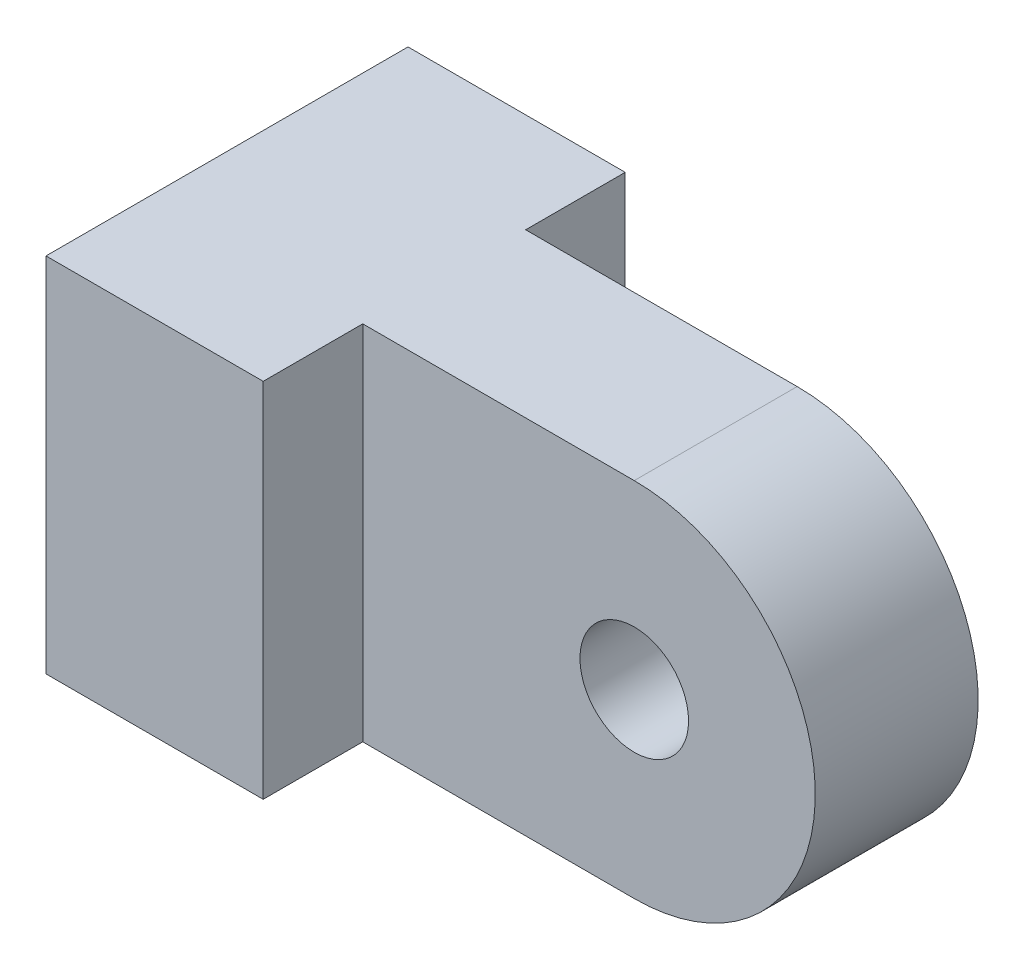
ISO-10303-21;
HEADER;
FILE_DESCRIPTION(('STEP AP214'),'2;1');
FILE_NAME('part.step','',(''),(''),'','','');
FILE_SCHEMA(('AUTOMOTIVE_DESIGN { 1 0 10303 214 1 1 1 1 }'));
ENDSEC;
DATA;
#1=APPLICATION_CONTEXT('core data for automotive mechanical design processes');
#2=APPLICATION_PROTOCOL_DEFINITION('international standard','automotive_design',2000,#1);
#3=PRODUCT_CONTEXT('',#1,'mechanical');
#4=PRODUCT('Part','Part','',(#3));
#5=PRODUCT_RELATED_PRODUCT_CATEGORY('part','',(#4));
#6=PRODUCT_DEFINITION_FORMATION('','',#4);
#7=PRODUCT_DEFINITION_CONTEXT('part definition',#1,'design');
#8=PRODUCT_DEFINITION('design','',#6,#7);
#9=PRODUCT_DEFINITION_SHAPE('','',#8);
#10=(LENGTH_UNIT() NAMED_UNIT(*) SI_UNIT(.MILLI.,.METRE.));
#11=(NAMED_UNIT(*) PLANE_ANGLE_UNIT() SI_UNIT($,.RADIAN.));
#12=(NAMED_UNIT(*) SI_UNIT($,.STERADIAN.) SOLID_ANGLE_UNIT());
#13=UNCERTAINTY_MEASURE_WITH_UNIT(LENGTH_MEASURE(1.E-05),#10,'distance_accuracy_value','');
#14=(GEOMETRIC_REPRESENTATION_CONTEXT(3) GLOBAL_UNCERTAINTY_ASSIGNED_CONTEXT((#13)) GLOBAL_UNIT_ASSIGNED_CONTEXT((#10,
#11,#12)) REPRESENTATION_CONTEXT('',''));
#15=CARTESIAN_POINT('',(0.,0.,0.));
#16=DIRECTION('',(0.,0.,1.));
#17=DIRECTION('',(1.,0.,0.));
#18=AXIS2_PLACEMENT_3D('',#15,#16,#17);
#19=CARTESIAN_POINT('',(37.,-10.,-4.5));
#20=DIRECTION('',(0.,0.,1.));
#21=DIRECTION('',(1.,0.,0.));
#22=AXIS2_PLACEMENT_3D('',#19,#20,#21);
#23=PLANE('',#22);
#24=CARTESIAN_POINT('',(27.,0.,-4.5));
#25=DIRECTION('',(0.,0.,-1.));
#26=DIRECTION('',(-1.,0.,0.));
#27=AXIS2_PLACEMENT_3D('',#24,#25,#26);
#28=CIRCLE('',#27,3.);
#29=CARTESIAN_POINT('',(24.,0.,-4.5));
#30=VERTEX_POINT('',#29);
#31=EDGE_CURVE('E144',#30,#30,#28,.T.);
#32=ORIENTED_EDGE('',*,*,#31,.F.);
#33=EDGE_LOOP('',(#32));
#34=FACE_BOUND('',#33,.T.);
#35=DIRECTION('',(-1.,0.,0.));
#36=VECTOR('',#35,1.);
#37=CARTESIAN_POINT('',(37.,10.,-4.5));
#38=LINE('',#37,#36);
#39=CARTESIAN_POINT('',(27.,10.,-4.5));
#40=VERTEX_POINT('',#39);
#41=CARTESIAN_POINT('',(12.,10.,-4.5));
#42=VERTEX_POINT('',#41);
#43=EDGE_CURVE('E161',#40,#42,#38,.T.);
#44=ORIENTED_EDGE('',*,*,#43,.F.);
#45=CARTESIAN_POINT('',(27.,0.,-4.5));
#46=DIRECTION('',(0.,0.,-1.));
#47=DIRECTION('',(-1.,0.,0.));
#48=AXIS2_PLACEMENT_3D('',#45,#46,#47);
#49=CIRCLE('',#48,10.);
#50=CARTESIAN_POINT('',(27.,-10.,-4.5));
#51=VERTEX_POINT('',#50);
#52=EDGE_CURVE('E235',#51,#40,#49,.F.);
#53=ORIENTED_EDGE('',*,*,#52,.F.);
#54=DIRECTION('',(-1.,0.,0.));
#55=VECTOR('',#54,1.);
#56=CARTESIAN_POINT('',(37.,-10.,-4.5));
#57=LINE('',#56,#55);
#58=CARTESIAN_POINT('',(12.,-10.0000000000001,-4.5));
#59=VERTEX_POINT('',#58);
#60=EDGE_CURVE('E64',#51,#59,#57,.T.);
#61=ORIENTED_EDGE('',*,*,#60,.T.);
#62=DIRECTION('',(0.,1.,0.));
#63=VECTOR('',#62,1.);
#64=CARTESIAN_POINT('',(12.,-10.,-4.5));
#65=LINE('',#64,#63);
#66=EDGE_CURVE('E147',#59,#42,#65,.T.);
#67=ORIENTED_EDGE('',*,*,#66,.T.);
#68=EDGE_LOOP('',(#44,#53,#61,#67));
#69=FACE_BOUND('',#68,.T.);
#70=ADVANCED_FACE('F41',(#34,#69),#23,.F.);
#71=CARTESIAN_POINT('',(37.,-10.,4.5));
#72=DIRECTION('',(0.,0.,1.));
#73=DIRECTION('',(1.,0.,0.));
#74=AXIS2_PLACEMENT_3D('',#71,#72,#73);
#75=PLANE('',#74);
#76=CARTESIAN_POINT('',(27.,0.,4.5));
#77=DIRECTION('',(0.,0.,1.));
#78=DIRECTION('',(1.,0.,0.));
#79=AXIS2_PLACEMENT_3D('',#76,#77,#78);
#80=CIRCLE('',#79,3.);
#81=CARTESIAN_POINT('',(30.,0.,4.5));
#82=VERTEX_POINT('',#81);
#83=EDGE_CURVE('E141',#82,#82,#80,.T.);
#84=ORIENTED_EDGE('',*,*,#83,.F.);
#85=EDGE_LOOP('',(#84));
#86=FACE_BOUND('',#85,.T.);
#87=CARTESIAN_POINT('',(27.,0.,4.5));
#88=DIRECTION('',(0.,0.,1.));
#89=DIRECTION('',(1.,0.,0.));
#90=AXIS2_PLACEMENT_3D('',#87,#88,#89);
#91=CIRCLE('',#90,10.);
#92=CARTESIAN_POINT('',(27.,10.,4.5));
#93=VERTEX_POINT('',#92);
#94=CARTESIAN_POINT('',(27.,-10.,4.5));
#95=VERTEX_POINT('',#94);
#96=EDGE_CURVE('E150',#93,#95,#91,.F.);
#97=ORIENTED_EDGE('',*,*,#96,.F.);
#98=DIRECTION('',(-1.,0.,0.));
#99=VECTOR('',#98,1.);
#100=CARTESIAN_POINT('',(37.,10.,4.5));
#101=LINE('',#100,#99);
#102=CARTESIAN_POINT('',(12.,10.,4.5));
#103=VERTEX_POINT('',#102);
#104=EDGE_CURVE('E56',#93,#103,#101,.T.);
#105=ORIENTED_EDGE('',*,*,#104,.T.);
#106=DIRECTION('',(0.,1.,0.));
#107=VECTOR('',#106,1.);
#108=CARTESIAN_POINT('',(12.,-10.,4.5));
#109=LINE('',#108,#107);
#110=CARTESIAN_POINT('',(12.,-10.0000000000001,4.5));
#111=VERTEX_POINT('',#110);
#112=EDGE_CURVE('E143',#111,#103,#109,.T.);
#113=ORIENTED_EDGE('',*,*,#112,.F.);
#114=DIRECTION('',(-1.,0.,0.));
#115=VECTOR('',#114,1.);
#116=CARTESIAN_POINT('',(37.,-10.,4.5));
#117=LINE('',#116,#115);
#118=EDGE_CURVE('E159',#95,#111,#117,.T.);
#119=ORIENTED_EDGE('',*,*,#118,.F.);
#120=EDGE_LOOP('',(#97,#105,#113,#119));
#121=FACE_BOUND('',#120,.T.);
#122=ADVANCED_FACE('F206',(#86,#121),#75,.T.);
#123=CARTESIAN_POINT('',(10.,10.,10.));
#124=DIRECTION('',(0.,-1.,0.));
#125=DIRECTION('',(0.,0.,-1.));
#126=AXIS2_PLACEMENT_3D('',#123,#124,#125);
#127=PLANE('',#126);
#128=DIRECTION('',(0.,0.,1.));
#129=VECTOR('',#128,1.);
#130=CARTESIAN_POINT('',(0.,10.,10.));
#131=LINE('',#130,#129);
#132=CARTESIAN_POINT('',(0.,10.,-9.99999999999993));
#133=VERTEX_POINT('',#132);
#134=CARTESIAN_POINT('',(0.,10.,10.));
#135=VERTEX_POINT('',#134);
#136=EDGE_CURVE('E115',#133,#135,#131,.T.);
#137=ORIENTED_EDGE('',*,*,#136,.T.);
#138=DIRECTION('',(-1.,0.,0.));
#139=VECTOR('',#138,1.);
#140=CARTESIAN_POINT('',(12.,10.,10.));
#141=LINE('',#140,#139);
#142=CARTESIAN_POINT('',(12.,10.,10.));
#143=VERTEX_POINT('',#142);
#144=EDGE_CURVE('E122',#143,#135,#141,.T.);
#145=ORIENTED_EDGE('',*,*,#144,.F.);
#146=DIRECTION('',(0.,0.,1.));
#147=VECTOR('',#146,1.);
#148=CARTESIAN_POINT('',(12.,10.,10.));
#149=LINE('',#148,#147);
#150=EDGE_CURVE('E172',#103,#143,#149,.T.);
#151=ORIENTED_EDGE('',*,*,#150,.F.);
#152=ORIENTED_EDGE('',*,*,#104,.F.);
#153=DIRECTION('',(0.,0.,-1.));
#154=VECTOR('',#153,1.);
#155=CARTESIAN_POINT('',(27.,10.,5.5));
#156=LINE('',#155,#154);
#157=EDGE_CURVE('E11',#40,#93,#156,.F.);
#158=ORIENTED_EDGE('',*,*,#157,.F.);
#159=ORIENTED_EDGE('',*,*,#43,.T.);
#160=CARTESIAN_POINT('',(12.,10.,-9.99999999999993));
#161=VERTEX_POINT('',#160);
#162=EDGE_CURVE('E129',#161,#42,#149,.T.);
#163=ORIENTED_EDGE('',*,*,#162,.F.);
#164=DIRECTION('',(-1.,0.,0.));
#165=VECTOR('',#164,1.);
#166=CARTESIAN_POINT('',(12.,10.,-9.99999999999993));
#167=LINE('',#166,#165);
#168=EDGE_CURVE('E128',#161,#133,#167,.T.);
#169=ORIENTED_EDGE('',*,*,#168,.T.);
#170=EDGE_LOOP('',(#137,#145,#151,#152,#158,#159,#163,#169));
#171=FACE_BOUND('',#170,.T.);
#172=ADVANCED_FACE('F132',(#171),#127,.F.);
#173=CARTESIAN_POINT('',(12.,0.,0.));
#174=DIRECTION('',(1.,0.,0.));
#175=DIRECTION('',(0.,0.,-1.));
#176=AXIS2_PLACEMENT_3D('',#173,#174,#175);
#177=PLANE('',#176);
#178=DIRECTION('',(0.,0.,-1.));
#179=VECTOR('',#178,1.);
#180=CARTESIAN_POINT('',(12.,-10.0000000000001,10.));
#181=LINE('',#180,#179);
#182=CARTESIAN_POINT('',(12.,-10.0000000000001,10.));
#183=VERTEX_POINT('',#182);
#184=EDGE_CURVE('E167',#183,#111,#181,.T.);
#185=ORIENTED_EDGE('',*,*,#184,.T.);
#186=ORIENTED_EDGE('',*,*,#112,.T.);
#187=ORIENTED_EDGE('',*,*,#150,.T.);
#188=DIRECTION('',(0.,-1.,0.));
#189=VECTOR('',#188,1.);
#190=CARTESIAN_POINT('',(12.,10.,10.));
#191=LINE('',#190,#189);
#192=EDGE_CURVE('E125',#143,#183,#191,.T.);
#193=ORIENTED_EDGE('',*,*,#192,.T.);
#194=EDGE_LOOP('',(#185,#186,#187,#193));
#195=FACE_BOUND('',#194,.T.);
#196=ADVANCED_FACE('F199',(#195),#177,.T.);
#197=CARTESIAN_POINT('',(10.,-10.,-10.));
#198=DIRECTION('',(0.,0.,1.));
#199=DIRECTION('',(1.,0.,0.));
#200=AXIS2_PLACEMENT_3D('',#197,#198,#199);
#201=PLANE('',#200);
#202=DIRECTION('',(-1.,0.,0.));
#203=VECTOR('',#202,1.);
#204=CARTESIAN_POINT('',(12.,-10.0000000000001,-9.99999999999993));
#205=LINE('',#204,#203);
#206=CARTESIAN_POINT('',(12.,-10.0000000000001,-9.99999999999993));
#207=VERTEX_POINT('',#206);
#208=CARTESIAN_POINT('',(0.,-10.,-9.99999999999993));
#209=VERTEX_POINT('',#208);
#210=EDGE_CURVE('E176',#207,#209,#205,.T.);
#211=ORIENTED_EDGE('',*,*,#210,.T.);
#212=DIRECTION('',(0.,1.,0.));
#213=VECTOR('',#212,1.);
#214=CARTESIAN_POINT('',(0.,-10.,-10.));
#215=LINE('',#214,#213);
#216=EDGE_CURVE('E135',#209,#133,#215,.T.);
#217=ORIENTED_EDGE('',*,*,#216,.T.);
#218=ORIENTED_EDGE('',*,*,#168,.F.);
#219=DIRECTION('',(0.,1.,0.));
#220=VECTOR('',#219,1.);
#221=CARTESIAN_POINT('',(12.,10.,-9.99999999999993));
#222=LINE('',#221,#220);
#223=EDGE_CURVE('E170',#207,#161,#222,.T.);
#224=ORIENTED_EDGE('',*,*,#223,.F.);
#225=EDGE_LOOP('',(#211,#217,#218,#224));
#226=FACE_BOUND('',#225,.T.);
#227=ADVANCED_FACE('F43',(#226),#201,.F.);
#228=CARTESIAN_POINT('',(10.,-10.,10.));
#229=DIRECTION('',(0.,0.,-1.));
#230=DIRECTION('',(-1.,0.,0.));
#231=AXIS2_PLACEMENT_3D('',#228,#229,#230);
#232=PLANE('',#231);
#233=ORIENTED_EDGE('',*,*,#144,.T.);
#234=DIRECTION('',(0.,-1.,0.));
#235=VECTOR('',#234,1.);
#236=CARTESIAN_POINT('',(0.,-10.,10.));
#237=LINE('',#236,#235);
#238=CARTESIAN_POINT('',(0.,-10.,10.));
#239=VERTEX_POINT('',#238);
#240=EDGE_CURVE('E109',#135,#239,#237,.T.);
#241=ORIENTED_EDGE('',*,*,#240,.T.);
#242=DIRECTION('',(-1.,0.,0.));
#243=VECTOR('',#242,1.);
#244=CARTESIAN_POINT('',(12.,-10.0000000000001,10.));
#245=LINE('',#244,#243);
#246=EDGE_CURVE('E179',#183,#239,#245,.T.);
#247=ORIENTED_EDGE('',*,*,#246,.F.);
#248=ORIENTED_EDGE('',*,*,#192,.F.);
#249=EDGE_LOOP('',(#233,#241,#247,#248));
#250=FACE_BOUND('',#249,.T.);
#251=ADVANCED_FACE('F123',(#250),#232,.F.);
#252=CARTESIAN_POINT('',(0.,0.,0.));
#253=DIRECTION('',(-1.,0.,0.));
#254=DIRECTION('',(0.,0.,1.));
#255=AXIS2_PLACEMENT_3D('',#252,#253,#254);
#256=PLANE('',#255);
#257=ORIENTED_EDGE('',*,*,#240,.F.);
#258=ORIENTED_EDGE('',*,*,#136,.F.);
#259=ORIENTED_EDGE('',*,*,#216,.F.);
#260=DIRECTION('',(0.,0.,-1.));
#261=VECTOR('',#260,1.);
#262=CARTESIAN_POINT('',(0.,-10.,10.));
#263=LINE('',#262,#261);
#264=EDGE_CURVE('E49',#239,#209,#263,.T.);
#265=ORIENTED_EDGE('',*,*,#264,.F.);
#266=EDGE_LOOP('',(#257,#258,#259,#265));
#267=FACE_BOUND('',#266,.T.);
#268=CARTESIAN_POINT('',(0.,0.,0.));
#269=DIRECTION('',(1.,0.,0.));
#270=DIRECTION('',(0.,0.,-1.));
#271=AXIS2_PLACEMENT_3D('',#268,#269,#270);
#272=CIRCLE('',#271,7.5);
#273=CARTESIAN_POINT('',(0.,0.,-7.5));
#274=VERTEX_POINT('',#273);
#275=EDGE_CURVE('E137',#274,#274,#272,.T.);
#276=ORIENTED_EDGE('',*,*,#275,.T.);
#277=EDGE_LOOP('',(#276));
#278=FACE_BOUND('',#277,.T.);
#279=ADVANCED_FACE('F111',(#267,#278),#256,.T.);
#280=CARTESIAN_POINT('',(10.,-10.,10.));
#281=DIRECTION('',(0.,1.,0.));
#282=DIRECTION('',(0.,0.,1.));
#283=AXIS2_PLACEMENT_3D('',#280,#281,#282);
#284=PLANE('',#283);
#285=ORIENTED_EDGE('',*,*,#246,.T.);
#286=ORIENTED_EDGE('',*,*,#264,.T.);
#287=ORIENTED_EDGE('',*,*,#210,.F.);
#288=EDGE_CURVE('E166',#59,#207,#181,.T.);
#289=ORIENTED_EDGE('',*,*,#288,.F.);
#290=ORIENTED_EDGE('',*,*,#60,.F.);
#291=DIRECTION('',(0.,0.,-1.));
#292=VECTOR('',#291,1.);
#293=CARTESIAN_POINT('',(27.,-10.,5.5));
#294=LINE('',#293,#292);
#295=EDGE_CURVE('E154',#95,#51,#294,.T.);
#296=ORIENTED_EDGE('',*,*,#295,.F.);
#297=ORIENTED_EDGE('',*,*,#118,.T.);
#298=ORIENTED_EDGE('',*,*,#184,.F.);
#299=EDGE_LOOP('',(#285,#286,#287,#289,#290,#296,#297,#298));
#300=FACE_BOUND('',#299,.T.);
#301=ADVANCED_FACE('F189',(#300),#284,.F.);
#302=CARTESIAN_POINT('',(10.,0.,0.));
#303=DIRECTION('',(-1.,0.,0.));
#304=DIRECTION('',(0.,0.,1.));
#305=AXIS2_PLACEMENT_3D('',#302,#303,#304);
#306=CYLINDRICAL_SURFACE('',#305,7.5);
#307=CARTESIAN_POINT('',(10.,0.,0.));
#308=DIRECTION('',(1.,0.,0.));
#309=DIRECTION('',(0.,0.,-1.));
#310=AXIS2_PLACEMENT_3D('',#307,#308,#309);
#311=CIRCLE('',#310,7.5);
#312=CARTESIAN_POINT('',(10.,0.,-7.5));
#313=VERTEX_POINT('',#312);
#314=EDGE_CURVE('E181',#313,#313,#311,.T.);
#315=ORIENTED_EDGE('',*,*,#314,.T.);
#316=EDGE_LOOP('',(#315));
#317=FACE_BOUND('',#316,.T.);
#318=ORIENTED_EDGE('',*,*,#275,.F.);
#319=EDGE_LOOP('',(#318));
#320=FACE_BOUND('',#319,.T.);
#321=ADVANCED_FACE('F186',(#317,#320),#306,.F.);
#322=ORIENTED_EDGE('',*,*,#66,.F.);
#323=ORIENTED_EDGE('',*,*,#288,.T.);
#324=ORIENTED_EDGE('',*,*,#223,.T.);
#325=ORIENTED_EDGE('',*,*,#162,.T.);
#326=EDGE_LOOP('',(#322,#323,#324,#325));
#327=FACE_BOUND('',#326,.T.);
#328=ADVANCED_FACE('F188',(#327),#177,.T.);
#329=CARTESIAN_POINT('',(10.,0.,0.));
#330=DIRECTION('',(1.,0.,0.));
#331=DIRECTION('',(0.,0.,-1.));
#332=AXIS2_PLACEMENT_3D('',#329,#330,#331);
#333=PLANE('',#332);
#334=ORIENTED_EDGE('',*,*,#314,.F.);
#335=EDGE_LOOP('',(#334));
#336=FACE_BOUND('',#335,.T.);
#337=ADVANCED_FACE('F196',(#336),#333,.F.);
#338=CARTESIAN_POINT('',(27.,0.,5.5));
#339=DIRECTION('',(0.,0.,-1.));
#340=DIRECTION('',(-1.,0.,0.));
#341=AXIS2_PLACEMENT_3D('',#338,#339,#340);
#342=CYLINDRICAL_SURFACE('',#341,3.);
#343=ORIENTED_EDGE('',*,*,#83,.T.);
#344=EDGE_LOOP('',(#343));
#345=FACE_BOUND('',#344,.T.);
#346=ORIENTED_EDGE('',*,*,#31,.T.);
#347=EDGE_LOOP('',(#346));
#348=FACE_BOUND('',#347,.T.);
#349=ADVANCED_FACE('F215',(#345,#348),#342,.F.);
#350=CARTESIAN_POINT('',(27.,0.,5.5));
#351=DIRECTION('',(0.,0.,-1.));
#352=DIRECTION('',(-1.,0.,0.));
#353=AXIS2_PLACEMENT_3D('',#350,#351,#352);
#354=CYLINDRICAL_SURFACE('',#353,10.);
#355=ORIENTED_EDGE('',*,*,#96,.T.);
#356=ORIENTED_EDGE('',*,*,#295,.T.);
#357=ORIENTED_EDGE('',*,*,#52,.T.);
#358=ORIENTED_EDGE('',*,*,#157,.T.);
#359=EDGE_LOOP('',(#355,#356,#357,#358));
#360=FACE_BOUND('',#359,.T.);
#361=ADVANCED_FACE('F222',(#360),#354,.T.);
#362=CLOSED_SHELL('',(#70,#122,#172,#196,#227,#251,#279,#301,#321,#328,#337,#349,#361));
#363=MANIFOLD_SOLID_BREP('B2',#362);
#364=ADVANCED_BREP_SHAPE_REPRESENTATION('',(#18,#363),#14);
#365=SHAPE_DEFINITION_REPRESENTATION(#9,#364);
ENDSEC;
END-ISO-10303-21;
